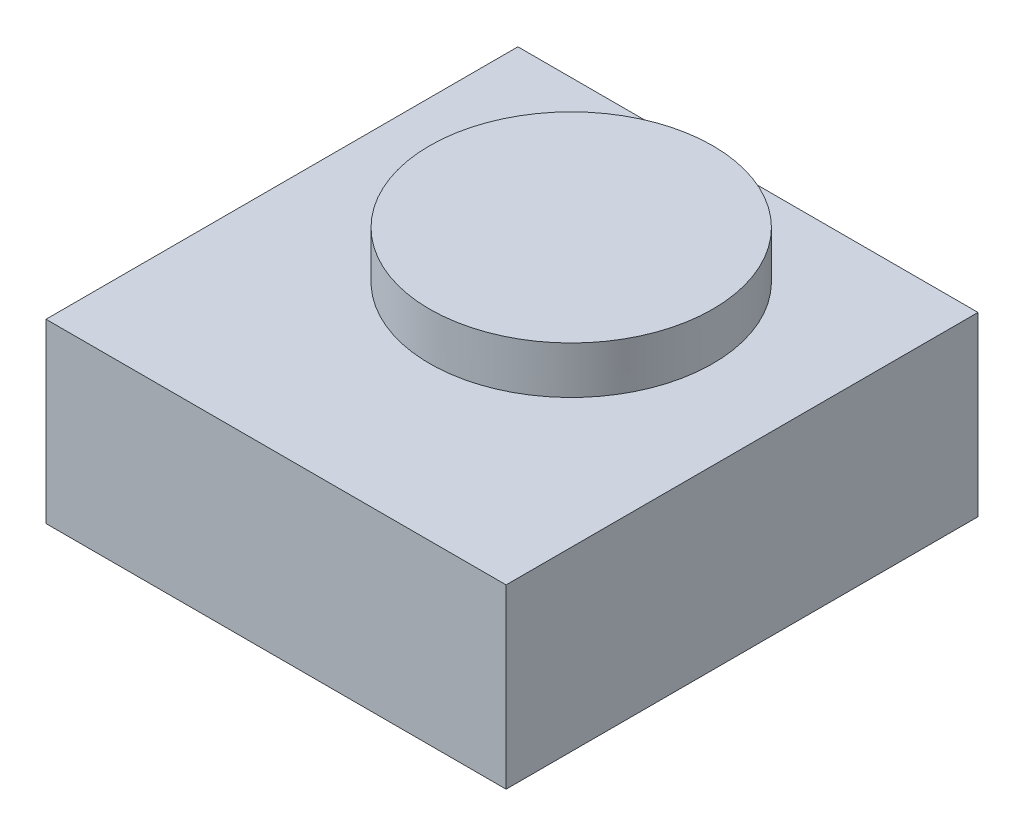
ISO-10303-21;
HEADER;
FILE_DESCRIPTION(('STEP AP214'),'2;1');
FILE_NAME('part.step','',(''),(''),'','','');
FILE_SCHEMA(('AUTOMOTIVE_DESIGN { 1 0 10303 214 1 1 1 1 }'));
ENDSEC;
DATA;
#1=APPLICATION_CONTEXT('core data for automotive mechanical design processes');
#2=APPLICATION_PROTOCOL_DEFINITION('international standard','automotive_design',2000,#1);
#3=PRODUCT_CONTEXT('',#1,'mechanical');
#4=PRODUCT('Part','Part','',(#3));
#5=PRODUCT_RELATED_PRODUCT_CATEGORY('part','',(#4));
#6=PRODUCT_DEFINITION_FORMATION('','',#4);
#7=PRODUCT_DEFINITION_CONTEXT('part definition',#1,'design');
#8=PRODUCT_DEFINITION('design','',#6,#7);
#9=PRODUCT_DEFINITION_SHAPE('','',#8);
#10=(LENGTH_UNIT() NAMED_UNIT(*) SI_UNIT(.MILLI.,.METRE.));
#11=(NAMED_UNIT(*) PLANE_ANGLE_UNIT() SI_UNIT($,.RADIAN.));
#12=(NAMED_UNIT(*) SI_UNIT($,.STERADIAN.) SOLID_ANGLE_UNIT());
#13=UNCERTAINTY_MEASURE_WITH_UNIT(LENGTH_MEASURE(1.E-05),#10,'distance_accuracy_value','');
#14=(GEOMETRIC_REPRESENTATION_CONTEXT(3) GLOBAL_UNCERTAINTY_ASSIGNED_CONTEXT((#13)) GLOBAL_UNIT_ASSIGNED_CONTEXT((#10,
#11,#12)) REPRESENTATION_CONTEXT('',''));
#15=CARTESIAN_POINT('',(0.,0.,0.));
#16=DIRECTION('',(0.,0.,1.));
#17=DIRECTION('',(1.,0.,0.));
#18=AXIS2_PLACEMENT_3D('',#15,#16,#17);
#19=CARTESIAN_POINT('',(0.,47.625,0.));
#20=DIRECTION('',(0.,-1.,0.));
#21=DIRECTION('',(0.,0.,-1.));
#22=AXIS2_PLACEMENT_3D('',#19,#20,#21);
#23=PLANE('',#22);
#24=DIRECTION('',(0.,0.,1.));
#25=VECTOR('',#24,1.);
#26=CARTESIAN_POINT('',(0.,47.625,0.));
#27=LINE('',#26,#25);
#28=CARTESIAN_POINT('',(0.,47.625,-127.));
#29=VERTEX_POINT('',#28);
#30=CARTESIAN_POINT('',(0.,47.625,0.));
#31=VERTEX_POINT('',#30);
#32=EDGE_CURVE('E86',#29,#31,#27,.T.);
#33=ORIENTED_EDGE('',*,*,#32,.T.);
#34=DIRECTION('',(1.,0.,0.));
#35=VECTOR('',#34,1.);
#36=CARTESIAN_POINT('',(0.,47.625,0.));
#37=LINE('',#36,#35);
#38=CARTESIAN_POINT('',(123.825,47.625,0.));
#39=VERTEX_POINT('',#38);
#40=EDGE_CURVE('E81',#31,#39,#37,.T.);
#41=ORIENTED_EDGE('',*,*,#40,.T.);
#42=DIRECTION('',(0.,0.,-1.));
#43=VECTOR('',#42,1.);
#44=CARTESIAN_POINT('',(123.825,47.625,0.));
#45=LINE('',#44,#43);
#46=CARTESIAN_POINT('',(123.825,47.625,-127.));
#47=VERTEX_POINT('',#46);
#48=EDGE_CURVE('E84',#39,#47,#45,.T.);
#49=ORIENTED_EDGE('',*,*,#48,.T.);
#50=DIRECTION('',(-1.,0.,0.));
#51=VECTOR('',#50,1.);
#52=CARTESIAN_POINT('',(0.,47.625,-127.));
#53=LINE('',#52,#51);
#54=EDGE_CURVE('E50',#47,#29,#53,.T.);
#55=ORIENTED_EDGE('',*,*,#54,.T.);
#56=EDGE_LOOP('',(#33,#41,#49,#55));
#57=FACE_BOUND('',#56,.T.);
#58=CARTESIAN_POINT('',(61.976,47.625,-79.375));
#59=DIRECTION('',(0.,-1.,0.));
#60=DIRECTION('',(0.,0.,-1.));
#61=AXIS2_PLACEMENT_3D('',#58,#59,#60);
#62=CIRCLE('',#61,38.1);
#63=CARTESIAN_POINT('',(61.976,47.625,-117.475));
#64=VERTEX_POINT('',#63);
#65=EDGE_CURVE('E11',#64,#64,#62,.F.);
#66=ORIENTED_EDGE('',*,*,#65,.F.);
#67=EDGE_LOOP('',(#66));
#68=FACE_BOUND('',#67,.T.);
#69=ADVANCED_FACE('F33',(#57,#68),#23,.F.);
#70=CARTESIAN_POINT('',(0.,47.625,0.));
#71=DIRECTION('',(1.,0.,0.));
#72=DIRECTION('',(0.,0.,-1.));
#73=AXIS2_PLACEMENT_3D('',#70,#71,#72);
#74=PLANE('',#73);
#75=DIRECTION('',(0.,0.,1.));
#76=VECTOR('',#75,1.);
#77=CARTESIAN_POINT('',(0.,0.,0.));
#78=LINE('',#77,#76);
#79=CARTESIAN_POINT('',(0.,0.,-127.));
#80=VERTEX_POINT('',#79);
#81=CARTESIAN_POINT('',(0.,0.,0.));
#82=VERTEX_POINT('',#81);
#83=EDGE_CURVE('E100',#80,#82,#78,.T.);
#84=ORIENTED_EDGE('',*,*,#83,.T.);
#85=DIRECTION('',(0.,-1.,0.));
#86=VECTOR('',#85,1.);
#87=CARTESIAN_POINT('',(0.,47.625,0.));
#88=LINE('',#87,#86);
#89=EDGE_CURVE('E42',#31,#82,#88,.T.);
#90=ORIENTED_EDGE('',*,*,#89,.F.);
#91=ORIENTED_EDGE('',*,*,#32,.F.);
#92=DIRECTION('',(0.,-1.,0.));
#93=VECTOR('',#92,1.);
#94=CARTESIAN_POINT('',(0.,47.625,-127.));
#95=LINE('',#94,#93);
#96=EDGE_CURVE('E96',#29,#80,#95,.T.);
#97=ORIENTED_EDGE('',*,*,#96,.T.);
#98=EDGE_LOOP('',(#84,#90,#91,#97));
#99=FACE_BOUND('',#98,.T.);
#100=ADVANCED_FACE('F35',(#99),#74,.F.);
#101=CARTESIAN_POINT('',(0.,47.625,0.));
#102=DIRECTION('',(0.,0.,-1.));
#103=DIRECTION('',(-1.,0.,0.));
#104=AXIS2_PLACEMENT_3D('',#101,#102,#103);
#105=PLANE('',#104);
#106=DIRECTION('',(1.,0.,0.));
#107=VECTOR('',#106,1.);
#108=CARTESIAN_POINT('',(0.,0.,0.));
#109=LINE('',#108,#107);
#110=CARTESIAN_POINT('',(123.825,0.,0.));
#111=VERTEX_POINT('',#110);
#112=EDGE_CURVE('E91',#82,#111,#109,.T.);
#113=ORIENTED_EDGE('',*,*,#112,.T.);
#114=DIRECTION('',(0.,-1.,0.));
#115=VECTOR('',#114,1.);
#116=CARTESIAN_POINT('',(123.825,47.625,0.));
#117=LINE('',#116,#115);
#118=EDGE_CURVE('E89',#39,#111,#117,.T.);
#119=ORIENTED_EDGE('',*,*,#118,.F.);
#120=ORIENTED_EDGE('',*,*,#40,.F.);
#121=ORIENTED_EDGE('',*,*,#89,.T.);
#122=EDGE_LOOP('',(#113,#119,#120,#121));
#123=FACE_BOUND('',#122,.T.);
#124=ADVANCED_FACE('F90',(#123),#105,.F.);
#125=CARTESIAN_POINT('',(123.825,47.625,0.));
#126=DIRECTION('',(-1.,0.,0.));
#127=DIRECTION('',(0.,0.,1.));
#128=AXIS2_PLACEMENT_3D('',#125,#126,#127);
#129=PLANE('',#128);
#130=DIRECTION('',(0.,0.,-1.));
#131=VECTOR('',#130,1.);
#132=CARTESIAN_POINT('',(123.825,0.,0.));
#133=LINE('',#132,#131);
#134=CARTESIAN_POINT('',(123.825,0.,-127.));
#135=VERTEX_POINT('',#134);
#136=EDGE_CURVE('E67',#111,#135,#133,.T.);
#137=ORIENTED_EDGE('',*,*,#136,.T.);
#138=DIRECTION('',(0.,-1.,0.));
#139=VECTOR('',#138,1.);
#140=CARTESIAN_POINT('',(123.825,47.625,-127.));
#141=LINE('',#140,#139);
#142=EDGE_CURVE('E92',#47,#135,#141,.T.);
#143=ORIENTED_EDGE('',*,*,#142,.F.);
#144=ORIENTED_EDGE('',*,*,#48,.F.);
#145=ORIENTED_EDGE('',*,*,#118,.T.);
#146=EDGE_LOOP('',(#137,#143,#144,#145));
#147=FACE_BOUND('',#146,.T.);
#148=ADVANCED_FACE('F94',(#147),#129,.F.);
#149=CARTESIAN_POINT('',(0.,47.625,-127.));
#150=DIRECTION('',(0.,0.,1.));
#151=DIRECTION('',(1.,0.,0.));
#152=AXIS2_PLACEMENT_3D('',#149,#150,#151);
#153=PLANE('',#152);
#154=DIRECTION('',(-1.,0.,0.));
#155=VECTOR('',#154,1.);
#156=CARTESIAN_POINT('',(0.,0.,-127.));
#157=LINE('',#156,#155);
#158=EDGE_CURVE('E73',#135,#80,#157,.T.);
#159=ORIENTED_EDGE('',*,*,#158,.T.);
#160=ORIENTED_EDGE('',*,*,#96,.F.);
#161=ORIENTED_EDGE('',*,*,#54,.F.);
#162=ORIENTED_EDGE('',*,*,#142,.T.);
#163=EDGE_LOOP('',(#159,#160,#161,#162));
#164=FACE_BOUND('',#163,.T.);
#165=ADVANCED_FACE('F114',(#164),#153,.F.);
#166=CARTESIAN_POINT('',(0.,0.,0.));
#167=DIRECTION('',(0.,-1.,0.));
#168=DIRECTION('',(0.,0.,-1.));
#169=AXIS2_PLACEMENT_3D('',#166,#167,#168);
#170=PLANE('',#169);
#171=ORIENTED_EDGE('',*,*,#83,.F.);
#172=ORIENTED_EDGE('',*,*,#158,.F.);
#173=ORIENTED_EDGE('',*,*,#136,.F.);
#174=ORIENTED_EDGE('',*,*,#112,.F.);
#175=EDGE_LOOP('',(#171,#172,#173,#174));
#176=FACE_BOUND('',#175,.T.);
#177=ADVANCED_FACE('F111',(#176),#170,.T.);
#178=CARTESIAN_POINT('',(61.976,60.325,-79.375));
#179=DIRECTION('',(0.,-1.,0.));
#180=DIRECTION('',(0.,0.,-1.));
#181=AXIS2_PLACEMENT_3D('',#178,#179,#180);
#182=CYLINDRICAL_SURFACE('',#181,38.1);
#183=CARTESIAN_POINT('',(61.976,60.325,-79.375));
#184=DIRECTION('',(0.,1.,0.));
#185=DIRECTION('',(0.,0.,1.));
#186=AXIS2_PLACEMENT_3D('',#183,#184,#185);
#187=CIRCLE('',#186,38.1);
#188=CARTESIAN_POINT('',(61.976,60.325,-41.275));
#189=VERTEX_POINT('',#188);
#190=EDGE_CURVE('E103',#189,#189,#187,.T.);
#191=ORIENTED_EDGE('',*,*,#190,.F.);
#192=EDGE_LOOP('',(#191));
#193=FACE_BOUND('',#192,.T.);
#194=ORIENTED_EDGE('',*,*,#65,.T.);
#195=EDGE_LOOP('',(#194));
#196=FACE_BOUND('',#195,.T.);
#197=ADVANCED_FACE('F113',(#193,#196),#182,.T.);
#198=CARTESIAN_POINT('',(61.976,60.325,-79.375));
#199=DIRECTION('',(0.,1.,0.));
#200=DIRECTION('',(0.,0.,1.));
#201=AXIS2_PLACEMENT_3D('',#198,#199,#200);
#202=PLANE('',#201);
#203=ORIENTED_EDGE('',*,*,#190,.T.);
#204=EDGE_LOOP('',(#203));
#205=FACE_BOUND('',#204,.T.);
#206=ADVANCED_FACE('F120',(#205),#202,.T.);
#207=CLOSED_SHELL('',(#69,#100,#124,#148,#165,#177,#197,#206));
#208=MANIFOLD_SOLID_BREP('B2',#207);
#209=ADVANCED_BREP_SHAPE_REPRESENTATION('',(#18,#208),#14);
#210=SHAPE_DEFINITION_REPRESENTATION(#9,#209);
ENDSEC;
END-ISO-10303-21;
